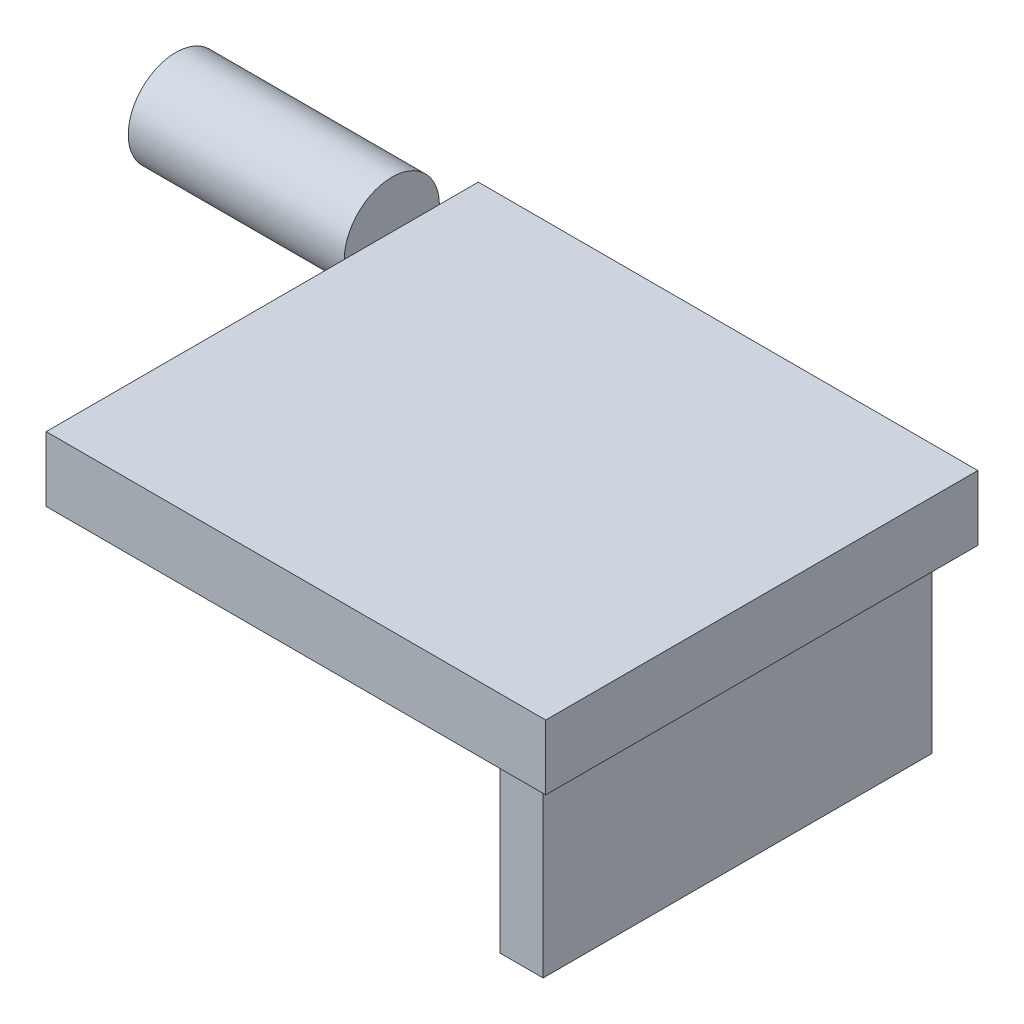
ISO-10303-21;
HEADER;
FILE_DESCRIPTION(('STEP AP214'),'2;1');
FILE_NAME('part.step','',(''),(''),'','','');
FILE_SCHEMA(('AUTOMOTIVE_DESIGN { 1 0 10303 214 1 1 1 1 }'));
ENDSEC;
DATA;
#1=APPLICATION_CONTEXT('core data for automotive mechanical design processes');
#2=APPLICATION_PROTOCOL_DEFINITION('international standard','automotive_design',2000,#1);
#3=PRODUCT_CONTEXT('',#1,'mechanical');
#4=PRODUCT('Part','Part','',(#3));
#5=PRODUCT_RELATED_PRODUCT_CATEGORY('part','',(#4));
#6=PRODUCT_DEFINITION_FORMATION('','',#4);
#7=PRODUCT_DEFINITION_CONTEXT('part definition',#1,'design');
#8=PRODUCT_DEFINITION('design','',#6,#7);
#9=PRODUCT_DEFINITION_SHAPE('','',#8);
#10=(LENGTH_UNIT() NAMED_UNIT(*) SI_UNIT(.MILLI.,.METRE.));
#11=(NAMED_UNIT(*) PLANE_ANGLE_UNIT() SI_UNIT($,.RADIAN.));
#12=(NAMED_UNIT(*) SI_UNIT($,.STERADIAN.) SOLID_ANGLE_UNIT());
#13=UNCERTAINTY_MEASURE_WITH_UNIT(LENGTH_MEASURE(1.E-05),#10,'distance_accuracy_value','');
#14=(GEOMETRIC_REPRESENTATION_CONTEXT(3) GLOBAL_UNCERTAINTY_ASSIGNED_CONTEXT((#13)) GLOBAL_UNIT_ASSIGNED_CONTEXT((#10,
#11,#12)) REPRESENTATION_CONTEXT('',''));
#15=CARTESIAN_POINT('',(0.,0.,0.));
#16=DIRECTION('',(0.,0.,1.));
#17=DIRECTION('',(1.,0.,0.));
#18=AXIS2_PLACEMENT_3D('',#15,#16,#17);
#19=CARTESIAN_POINT('',(0.,0.,0.));
#20=DIRECTION('',(0.,-1.,0.));
#21=DIRECTION('',(0.,0.,-1.));
#22=AXIS2_PLACEMENT_3D('',#19,#20,#21);
#23=PLANE('',#22);
#24=DIRECTION('',(0.,0.,1.));
#25=VECTOR('',#24,1.);
#26=CARTESIAN_POINT('',(0.,0.,0.));
#27=LINE('',#26,#25);
#28=CARTESIAN_POINT('',(0.,0.,-25.4));
#29=VERTEX_POINT('',#28);
#30=CARTESIAN_POINT('',(0.,0.,0.));
#31=VERTEX_POINT('',#30);
#32=EDGE_CURVE('E156',#29,#31,#27,.T.);
#33=ORIENTED_EDGE('',*,*,#32,.F.);
#34=DIRECTION('',(-1.,0.,0.));
#35=VECTOR('',#34,1.);
#36=CARTESIAN_POINT('',(0.,0.,-25.4));
#37=LINE('',#36,#35);
#38=CARTESIAN_POINT('',(29.3624,0.,-25.4));
#39=VERTEX_POINT('',#38);
#40=EDGE_CURVE('E122',#39,#29,#37,.T.);
#41=ORIENTED_EDGE('',*,*,#40,.F.);
#42=DIRECTION('',(0.,0.,-1.));
#43=VECTOR('',#42,1.);
#44=CARTESIAN_POINT('',(29.3624,0.,0.));
#45=LINE('',#44,#43);
#46=CARTESIAN_POINT('',(29.3624,0.,0.));
#47=VERTEX_POINT('',#46);
#48=EDGE_CURVE('E168',#47,#39,#45,.T.);
#49=ORIENTED_EDGE('',*,*,#48,.F.);
#50=DIRECTION('',(1.,0.,0.));
#51=VECTOR('',#50,1.);
#52=CARTESIAN_POINT('',(0.,0.,0.));
#53=LINE('',#52,#51);
#54=EDGE_CURVE('E166',#31,#47,#53,.T.);
#55=ORIENTED_EDGE('',*,*,#54,.F.);
#56=EDGE_LOOP('',(#33,#41,#49,#55));
#57=FACE_BOUND('',#56,.T.);
#58=DIRECTION('',(1.,0.,0.));
#59=VECTOR('',#58,1.);
#60=CARTESIAN_POINT('',(27.94,0.,-24.13));
#61=LINE('',#60,#59);
#62=CARTESIAN_POINT('',(25.4,0.,-24.13));
#63=VERTEX_POINT('',#62);
#64=CARTESIAN_POINT('',(27.94,0.,-24.13));
#65=VERTEX_POINT('',#64);
#66=EDGE_CURVE('E144',#63,#65,#61,.T.);
#67=ORIENTED_EDGE('',*,*,#66,.F.);
#68=DIRECTION('',(0.,0.,-1.));
#69=VECTOR('',#68,1.);
#70=CARTESIAN_POINT('',(25.4,0.,-24.13));
#71=LINE('',#70,#69);
#72=CARTESIAN_POINT('',(25.4,0.,-1.26999999999998));
#73=VERTEX_POINT('',#72);
#74=EDGE_CURVE('E128',#73,#63,#71,.T.);
#75=ORIENTED_EDGE('',*,*,#74,.F.);
#76=DIRECTION('',(-1.,0.,0.));
#77=VECTOR('',#76,1.);
#78=CARTESIAN_POINT('',(27.94,0.,-1.26999999999998));
#79=LINE('',#78,#77);
#80=CARTESIAN_POINT('',(27.94,0.,-1.26999999999998));
#81=VERTEX_POINT('',#80);
#82=EDGE_CURVE('E135',#81,#73,#79,.T.);
#83=ORIENTED_EDGE('',*,*,#82,.F.);
#84=DIRECTION('',(0.,0.,1.));
#85=VECTOR('',#84,1.);
#86=CARTESIAN_POINT('',(27.94,0.,-24.13));
#87=LINE('',#86,#85);
#88=EDGE_CURVE('E146',#65,#81,#87,.T.);
#89=ORIENTED_EDGE('',*,*,#88,.F.);
#90=EDGE_LOOP('',(#67,#75,#83,#89));
#91=FACE_BOUND('',#90,.T.);
#92=ADVANCED_FACE('F37',(#57,#91),#23,.T.);
#93=CARTESIAN_POINT('',(0.,3.81,0.));
#94=DIRECTION('',(1.,0.,0.));
#95=DIRECTION('',(0.,0.,-1.));
#96=AXIS2_PLACEMENT_3D('',#93,#94,#95);
#97=PLANE('',#96);
#98=CARTESIAN_POINT('',(0.,3.81,-20.32));
#99=DIRECTION('',(-1.,0.,0.));
#100=DIRECTION('',(0.,0.,1.));
#101=AXIS2_PLACEMENT_3D('',#98,#99,#100);
#102=CIRCLE('',#101,2.794);
#103=CARTESIAN_POINT('',(0.,3.81,-23.114));
#104=VERTEX_POINT('',#103);
#105=CARTESIAN_POINT('',(0.,3.81,-17.526));
#106=VERTEX_POINT('',#105);
#107=EDGE_CURVE('E11',#104,#106,#102,.T.);
#108=ORIENTED_EDGE('',*,*,#107,.F.);
#109=DIRECTION('',(0.,0.,1.));
#110=VECTOR('',#109,1.);
#111=CARTESIAN_POINT('',(0.,3.81,0.));
#112=LINE('',#111,#110);
#113=CARTESIAN_POINT('',(0.,3.81,-25.4));
#114=VERTEX_POINT('',#113);
#115=EDGE_CURVE('E114',#114,#104,#112,.T.);
#116=ORIENTED_EDGE('',*,*,#115,.F.);
#117=DIRECTION('',(0.,-1.,0.));
#118=VECTOR('',#117,1.);
#119=CARTESIAN_POINT('',(0.,3.81,-25.4));
#120=LINE('',#119,#118);
#121=EDGE_CURVE('E164',#114,#29,#120,.T.);
#122=ORIENTED_EDGE('',*,*,#121,.T.);
#123=ORIENTED_EDGE('',*,*,#32,.T.);
#124=DIRECTION('',(0.,-1.,0.));
#125=VECTOR('',#124,1.);
#126=CARTESIAN_POINT('',(0.,3.81,0.));
#127=LINE('',#126,#125);
#128=CARTESIAN_POINT('',(0.,3.81,0.));
#129=VERTEX_POINT('',#128);
#130=EDGE_CURVE('E41',#129,#31,#127,.T.);
#131=ORIENTED_EDGE('',*,*,#130,.F.);
#132=EDGE_CURVE('E112',#106,#129,#112,.T.);
#133=ORIENTED_EDGE('',*,*,#132,.F.);
#134=EDGE_LOOP('',(#108,#116,#122,#123,#131,#133));
#135=FACE_BOUND('',#134,.T.);
#136=ADVANCED_FACE('F39',(#135),#97,.F.);
#137=CARTESIAN_POINT('',(0.,3.81,0.));
#138=DIRECTION('',(0.,0.,-1.));
#139=DIRECTION('',(-1.,0.,0.));
#140=AXIS2_PLACEMENT_3D('',#137,#138,#139);
#141=PLANE('',#140);
#142=ORIENTED_EDGE('',*,*,#54,.T.);
#143=DIRECTION('',(0.,-1.,0.));
#144=VECTOR('',#143,1.);
#145=CARTESIAN_POINT('',(29.3624,3.81,0.));
#146=LINE('',#145,#144);
#147=CARTESIAN_POINT('',(29.3624,3.81,0.));
#148=VERTEX_POINT('',#147);
#149=EDGE_CURVE('E175',#148,#47,#146,.T.);
#150=ORIENTED_EDGE('',*,*,#149,.F.);
#151=DIRECTION('',(1.,0.,0.));
#152=VECTOR('',#151,1.);
#153=CARTESIAN_POINT('',(0.,3.81,0.));
#154=LINE('',#153,#152);
#155=EDGE_CURVE('E158',#129,#148,#154,.T.);
#156=ORIENTED_EDGE('',*,*,#155,.F.);
#157=ORIENTED_EDGE('',*,*,#130,.T.);
#158=EDGE_LOOP('',(#142,#150,#156,#157));
#159=FACE_BOUND('',#158,.T.);
#160=ADVANCED_FACE('F182',(#159),#141,.F.);
#161=CARTESIAN_POINT('',(29.3624,3.81,0.));
#162=DIRECTION('',(-1.,0.,0.));
#163=DIRECTION('',(0.,0.,1.));
#164=AXIS2_PLACEMENT_3D('',#161,#162,#163);
#165=PLANE('',#164);
#166=ORIENTED_EDGE('',*,*,#48,.T.);
#167=DIRECTION('',(0.,-1.,0.));
#168=VECTOR('',#167,1.);
#169=CARTESIAN_POINT('',(29.3624,3.81,-25.4));
#170=LINE('',#169,#168);
#171=CARTESIAN_POINT('',(29.3624,3.81,-25.4));
#172=VERTEX_POINT('',#171);
#173=EDGE_CURVE('E173',#172,#39,#170,.T.);
#174=ORIENTED_EDGE('',*,*,#173,.F.);
#175=DIRECTION('',(0.,0.,-1.));
#176=VECTOR('',#175,1.);
#177=CARTESIAN_POINT('',(29.3624,3.81,0.));
#178=LINE('',#177,#176);
#179=EDGE_CURVE('E160',#148,#172,#178,.T.);
#180=ORIENTED_EDGE('',*,*,#179,.F.);
#181=ORIENTED_EDGE('',*,*,#149,.T.);
#182=EDGE_LOOP('',(#166,#174,#180,#181));
#183=FACE_BOUND('',#182,.T.);
#184=ADVANCED_FACE('F189',(#183),#165,.F.);
#185=CARTESIAN_POINT('',(0.,3.81,-25.4));
#186=DIRECTION('',(0.,0.,1.));
#187=DIRECTION('',(1.,0.,0.));
#188=AXIS2_PLACEMENT_3D('',#185,#186,#187);
#189=PLANE('',#188);
#190=ORIENTED_EDGE('',*,*,#40,.T.);
#191=ORIENTED_EDGE('',*,*,#121,.F.);
#192=DIRECTION('',(-1.,0.,0.));
#193=VECTOR('',#192,1.);
#194=CARTESIAN_POINT('',(0.,3.81,-25.4));
#195=LINE('',#194,#193);
#196=EDGE_CURVE('E162',#172,#114,#195,.T.);
#197=ORIENTED_EDGE('',*,*,#196,.F.);
#198=ORIENTED_EDGE('',*,*,#173,.T.);
#199=EDGE_LOOP('',(#190,#191,#197,#198));
#200=FACE_BOUND('',#199,.T.);
#201=ADVANCED_FACE('F192',(#200),#189,.F.);
#202=CARTESIAN_POINT('',(0.,3.81,0.));
#203=DIRECTION('',(0.,-1.,0.));
#204=DIRECTION('',(0.,0.,-1.));
#205=AXIS2_PLACEMENT_3D('',#202,#203,#204);
#206=PLANE('',#205);
#207=ORIENTED_EDGE('',*,*,#115,.T.);
#208=EDGE_CURVE('E110',#104,#106,#112,.T.);
#209=ORIENTED_EDGE('',*,*,#208,.T.);
#210=ORIENTED_EDGE('',*,*,#132,.T.);
#211=ORIENTED_EDGE('',*,*,#155,.T.);
#212=ORIENTED_EDGE('',*,*,#179,.T.);
#213=ORIENTED_EDGE('',*,*,#196,.T.);
#214=EDGE_LOOP('',(#207,#209,#210,#211,#212,#213));
#215=FACE_BOUND('',#214,.T.);
#216=ADVANCED_FACE('F111',(#215),#206,.F.);
#217=CARTESIAN_POINT('',(25.4,-10.668,-24.13));
#218=DIRECTION('',(1.,0.,0.));
#219=DIRECTION('',(0.,0.,-1.));
#220=AXIS2_PLACEMENT_3D('',#217,#218,#219);
#221=PLANE('',#220);
#222=ORIENTED_EDGE('',*,*,#74,.T.);
#223=DIRECTION('',(0.,1.,0.));
#224=VECTOR('',#223,1.);
#225=CARTESIAN_POINT('',(25.4,-10.668,-24.13));
#226=LINE('',#225,#224);
#227=CARTESIAN_POINT('',(25.4,-10.668,-24.13));
#228=VERTEX_POINT('',#227);
#229=EDGE_CURVE('E155',#228,#63,#226,.T.);
#230=ORIENTED_EDGE('',*,*,#229,.F.);
#231=DIRECTION('',(0.,0.,-1.));
#232=VECTOR('',#231,1.);
#233=CARTESIAN_POINT('',(25.4,-10.668,-24.13));
#234=LINE('',#233,#232);
#235=CARTESIAN_POINT('',(25.4,-10.668,-1.26999999999998));
#236=VERTEX_POINT('',#235);
#237=EDGE_CURVE('E131',#236,#228,#234,.T.);
#238=ORIENTED_EDGE('',*,*,#237,.F.);
#239=DIRECTION('',(0.,1.,0.));
#240=VECTOR('',#239,1.);
#241=CARTESIAN_POINT('',(25.4,-10.668,-1.26999999999998));
#242=LINE('',#241,#240);
#243=EDGE_CURVE('E141',#236,#73,#242,.T.);
#244=ORIENTED_EDGE('',*,*,#243,.T.);
#245=EDGE_LOOP('',(#222,#230,#238,#244));
#246=FACE_BOUND('',#245,.T.);
#247=ADVANCED_FACE('F200',(#246),#221,.F.);
#248=CARTESIAN_POINT('',(27.94,-10.668,-24.13));
#249=DIRECTION('',(0.,0.,1.));
#250=DIRECTION('',(1.,0.,0.));
#251=AXIS2_PLACEMENT_3D('',#248,#249,#250);
#252=PLANE('',#251);
#253=ORIENTED_EDGE('',*,*,#66,.T.);
#254=DIRECTION('',(0.,1.,0.));
#255=VECTOR('',#254,1.);
#256=CARTESIAN_POINT('',(27.94,-10.668,-24.13));
#257=LINE('',#256,#255);
#258=CARTESIAN_POINT('',(27.94,-10.668,-24.13));
#259=VERTEX_POINT('',#258);
#260=EDGE_CURVE('E152',#259,#65,#257,.T.);
#261=ORIENTED_EDGE('',*,*,#260,.F.);
#262=DIRECTION('',(1.,0.,0.));
#263=VECTOR('',#262,1.);
#264=CARTESIAN_POINT('',(27.94,-10.668,-24.13));
#265=LINE('',#264,#263);
#266=EDGE_CURVE('E134',#228,#259,#265,.T.);
#267=ORIENTED_EDGE('',*,*,#266,.F.);
#268=ORIENTED_EDGE('',*,*,#229,.T.);
#269=EDGE_LOOP('',(#253,#261,#267,#268));
#270=FACE_BOUND('',#269,.T.);
#271=ADVANCED_FACE('F212',(#270),#252,.F.);
#272=CARTESIAN_POINT('',(27.94,-10.668,-24.13));
#273=DIRECTION('',(-1.,0.,0.));
#274=DIRECTION('',(0.,0.,1.));
#275=AXIS2_PLACEMENT_3D('',#272,#273,#274);
#276=PLANE('',#275);
#277=ORIENTED_EDGE('',*,*,#88,.T.);
#278=DIRECTION('',(0.,1.,0.));
#279=VECTOR('',#278,1.);
#280=CARTESIAN_POINT('',(27.94,-10.668,-1.26999999999998));
#281=LINE('',#280,#279);
#282=CARTESIAN_POINT('',(27.94,-10.668,-1.26999999999998));
#283=VERTEX_POINT('',#282);
#284=EDGE_CURVE('E60',#283,#81,#281,.T.);
#285=ORIENTED_EDGE('',*,*,#284,.F.);
#286=DIRECTION('',(0.,0.,1.));
#287=VECTOR('',#286,1.);
#288=CARTESIAN_POINT('',(27.94,-10.668,-24.13));
#289=LINE('',#288,#287);
#290=EDGE_CURVE('E137',#259,#283,#289,.T.);
#291=ORIENTED_EDGE('',*,*,#290,.F.);
#292=ORIENTED_EDGE('',*,*,#260,.T.);
#293=EDGE_LOOP('',(#277,#285,#291,#292));
#294=FACE_BOUND('',#293,.T.);
#295=ADVANCED_FACE('F216',(#294),#276,.F.);
#296=CARTESIAN_POINT('',(27.94,-10.668,-1.26999999999998));
#297=DIRECTION('',(0.,0.,-1.));
#298=DIRECTION('',(-1.,0.,0.));
#299=AXIS2_PLACEMENT_3D('',#296,#297,#298);
#300=PLANE('',#299);
#301=ORIENTED_EDGE('',*,*,#82,.T.);
#302=ORIENTED_EDGE('',*,*,#243,.F.);
#303=DIRECTION('',(-1.,0.,0.));
#304=VECTOR('',#303,1.);
#305=CARTESIAN_POINT('',(27.94,-10.668,-1.26999999999998));
#306=LINE('',#305,#304);
#307=EDGE_CURVE('E139',#283,#236,#306,.T.);
#308=ORIENTED_EDGE('',*,*,#307,.F.);
#309=ORIENTED_EDGE('',*,*,#284,.T.);
#310=EDGE_LOOP('',(#301,#302,#308,#309));
#311=FACE_BOUND('',#310,.T.);
#312=ADVANCED_FACE('F220',(#311),#300,.F.);
#313=CARTESIAN_POINT('',(0.,-10.668,0.));
#314=DIRECTION('',(0.,-1.,0.));
#315=DIRECTION('',(0.,0.,-1.));
#316=AXIS2_PLACEMENT_3D('',#313,#314,#315);
#317=PLANE('',#316);
#318=ORIENTED_EDGE('',*,*,#237,.T.);
#319=ORIENTED_EDGE('',*,*,#266,.T.);
#320=ORIENTED_EDGE('',*,*,#290,.T.);
#321=ORIENTED_EDGE('',*,*,#307,.T.);
#322=EDGE_LOOP('',(#318,#319,#320,#321));
#323=FACE_BOUND('',#322,.T.);
#324=ADVANCED_FACE('F224',(#323),#317,.T.);
#325=CARTESIAN_POINT('',(-12.7,3.81,-20.32));
#326=DIRECTION('',(1.,0.,0.));
#327=DIRECTION('',(0.,0.,-1.));
#328=AXIS2_PLACEMENT_3D('',#325,#326,#327);
#329=CYLINDRICAL_SURFACE('',#328,2.794);
#330=CARTESIAN_POINT('',(-12.7,3.81,-20.32));
#331=DIRECTION('',(-1.,0.,0.));
#332=DIRECTION('',(0.,0.,1.));
#333=AXIS2_PLACEMENT_3D('',#330,#331,#332);
#334=CIRCLE('',#333,2.794);
#335=CARTESIAN_POINT('',(-12.7,3.81,-17.526));
#336=VERTEX_POINT('',#335);
#337=EDGE_CURVE('E126',#336,#336,#334,.T.);
#338=ORIENTED_EDGE('',*,*,#337,.F.);
#339=EDGE_LOOP('',(#338));
#340=FACE_BOUND('',#339,.T.);
#341=EDGE_CURVE('E47',#106,#104,#102,.T.);
#342=ORIENTED_EDGE('',*,*,#341,.T.);
#343=ORIENTED_EDGE('',*,*,#107,.T.);
#344=EDGE_LOOP('',(#342,#343));
#345=FACE_BOUND('',#344,.T.);
#346=ADVANCED_FACE('F124',(#340,#345),#329,.T.);
#347=CARTESIAN_POINT('',(-12.7,3.81,-20.32));
#348=DIRECTION('',(-1.,0.,0.));
#349=DIRECTION('',(0.,0.,1.));
#350=AXIS2_PLACEMENT_3D('',#347,#348,#349);
#351=PLANE('',#350);
#352=ORIENTED_EDGE('',*,*,#337,.T.);
#353=EDGE_LOOP('',(#352));
#354=FACE_BOUND('',#353,.T.);
#355=ADVANCED_FACE('F230',(#354),#351,.T.);
#356=CARTESIAN_POINT('',(0.,3.81,-20.32));
#357=DIRECTION('',(-1.,0.,0.));
#358=DIRECTION('',(0.,0.,1.));
#359=AXIS2_PLACEMENT_3D('',#356,#357,#358);
#360=PLANE('',#359);
#361=ORIENTED_EDGE('',*,*,#208,.F.);
#362=ORIENTED_EDGE('',*,*,#341,.F.);
#363=EDGE_LOOP('',(#361,#362));
#364=FACE_BOUND('',#363,.T.);
#365=ADVANCED_FACE('F125',(#364),#360,.F.);
#366=CLOSED_SHELL('',(#92,#136,#160,#184,#201,#216,#247,#271,#295,#312,#324,#346,#355,#365));
#367=MANIFOLD_SOLID_BREP('B2',#366);
#368=ADVANCED_BREP_SHAPE_REPRESENTATION('',(#18,#367),#14);
#369=SHAPE_DEFINITION_REPRESENTATION(#9,#368);
ENDSEC;
END-ISO-10303-21;
